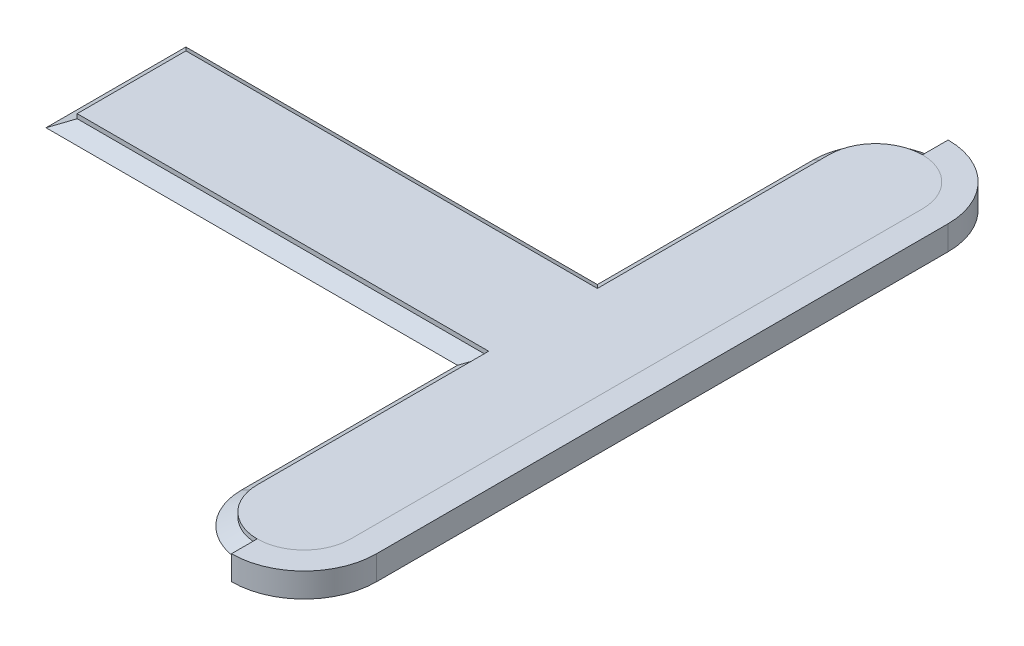
ISO-10303-21;
HEADER;
FILE_DESCRIPTION(('STEP AP214'),'2;1');
FILE_NAME('part.step','',(''),(''),'','','');
FILE_SCHEMA(('AUTOMOTIVE_DESIGN { 1 0 10303 214 1 1 1 1 }'));
ENDSEC;
DATA;
#1=APPLICATION_CONTEXT('core data for automotive mechanical design processes');
#2=APPLICATION_PROTOCOL_DEFINITION('international standard','automotive_design',2000,#1);
#3=PRODUCT_CONTEXT('',#1,'mechanical');
#4=PRODUCT('Part','Part','',(#3));
#5=PRODUCT_RELATED_PRODUCT_CATEGORY('part','',(#4));
#6=PRODUCT_DEFINITION_FORMATION('','',#4);
#7=PRODUCT_DEFINITION_CONTEXT('part definition',#1,'design');
#8=PRODUCT_DEFINITION('design','',#6,#7);
#9=PRODUCT_DEFINITION_SHAPE('','',#8);
#10=(LENGTH_UNIT() NAMED_UNIT(*) SI_UNIT(.MILLI.,.METRE.));
#11=(NAMED_UNIT(*) PLANE_ANGLE_UNIT() SI_UNIT($,.RADIAN.));
#12=(NAMED_UNIT(*) SI_UNIT($,.STERADIAN.) SOLID_ANGLE_UNIT());
#13=UNCERTAINTY_MEASURE_WITH_UNIT(LENGTH_MEASURE(1.E-05),#10,'distance_accuracy_value','');
#14=(GEOMETRIC_REPRESENTATION_CONTEXT(3) GLOBAL_UNCERTAINTY_ASSIGNED_CONTEXT((#13)) GLOBAL_UNIT_ASSIGNED_CONTEXT((#10,
#11,#12)) REPRESENTATION_CONTEXT('',''));
#15=CARTESIAN_POINT('',(0.,0.,0.));
#16=DIRECTION('',(0.,0.,1.));
#17=DIRECTION('',(1.,0.,0.));
#18=AXIS2_PLACEMENT_3D('',#15,#16,#17);
#19=CARTESIAN_POINT('',(113.157,-177.860840145929,70.5715536280061));
#20=DIRECTION('',(0.,1.,0.));
#21=DIRECTION('',(0.,0.,1.));
#22=AXIS2_PLACEMENT_3D('',#19,#20,#21);
#23=CYLINDRICAL_SURFACE('',#22,17.9070000000001);
#24=CARTESIAN_POINT('',(113.157,0.,70.5715536280061));
#25=DIRECTION('',(0.,1.,0.));
#26=DIRECTION('',(0.,0.,1.));
#27=AXIS2_PLACEMENT_3D('',#24,#25,#26);
#28=CIRCLE('',#27,17.9070000000001);
#29=CARTESIAN_POINT('',(131.064,0.,70.5715536280061));
#30=VERTEX_POINT('',#29);
#31=CARTESIAN_POINT('',(113.157,0.,88.4785536280062));
#32=VERTEX_POINT('',#31);
#33=EDGE_CURVE('E64',#30,#32,#28,.F.);
#34=ORIENTED_EDGE('',*,*,#33,.F.);
#35=DIRECTION('',(0.,1.,0.));
#36=VECTOR('',#35,1.);
#37=CARTESIAN_POINT('',(131.064,-177.860840145929,70.5715536280061));
#38=LINE('',#37,#36);
#39=CARTESIAN_POINT('',(131.064,6.,70.5715536280061));
#40=VERTEX_POINT('',#39);
#41=EDGE_CURVE('E137',#30,#40,#38,.T.);
#42=ORIENTED_EDGE('',*,*,#41,.T.);
#43=CARTESIAN_POINT('',(113.157,6.,70.5715536280061));
#44=DIRECTION('',(0.,1.,0.));
#45=DIRECTION('',(0.,0.,1.));
#46=AXIS2_PLACEMENT_3D('',#43,#44,#45);
#47=CIRCLE('',#46,17.9070000000001);
#48=CARTESIAN_POINT('',(113.157,6.,88.4785536280062));
#49=VERTEX_POINT('',#48);
#50=EDGE_CURVE('E164',#49,#40,#47,.T.);
#51=ORIENTED_EDGE('',*,*,#50,.F.);
#52=DIRECTION('',(0.,1.,0.));
#53=VECTOR('',#52,1.);
#54=CARTESIAN_POINT('',(113.157,-177.860840145929,88.4785536280062));
#55=LINE('',#54,#53);
#56=EDGE_CURVE('E124',#32,#49,#55,.T.);
#57=ORIENTED_EDGE('',*,*,#56,.F.);
#58=EDGE_LOOP('',(#34,#42,#51,#57));
#59=FACE_BOUND('',#58,.T.);
#60=ADVANCED_FACE('F57',(#59),#23,.T.);
#61=CARTESIAN_POINT('',(113.157,-177.860840145929,82.1285536280061));
#62=DIRECTION('',(-1.,0.,0.));
#63=DIRECTION('',(0.,0.,1.));
#64=AXIS2_PLACEMENT_3D('',#61,#62,#63);
#65=PLANE('',#64);
#66=DIRECTION('',(0.,0.,-1.));
#67=VECTOR('',#66,1.);
#68=CARTESIAN_POINT('',(113.157,0.,82.1285536280061));
#69=LINE('',#68,#67);
#70=CARTESIAN_POINT('',(113.157,0.,82.1285536280061));
#71=VERTEX_POINT('',#70);
#72=EDGE_CURVE('E101',#32,#71,#69,.T.);
#73=ORIENTED_EDGE('',*,*,#72,.F.);
#74=ORIENTED_EDGE('',*,*,#56,.T.);
#75=DIRECTION('',(0.,0.,1.));
#76=VECTOR('',#75,1.);
#77=CARTESIAN_POINT('',(113.157,6.,82.1285536280061));
#78=LINE('',#77,#76);
#79=CARTESIAN_POINT('',(113.157,6.,82.1285536280061));
#80=VERTEX_POINT('',#79);
#81=EDGE_CURVE('E139',#80,#49,#78,.T.);
#82=ORIENTED_EDGE('',*,*,#81,.F.);
#83=DIRECTION('',(0.,1.,0.));
#84=VECTOR('',#83,1.);
#85=CARTESIAN_POINT('',(113.157,-177.860840145929,82.1285536280061));
#86=LINE('',#85,#84);
#87=EDGE_CURVE('E122',#71,#80,#86,.T.);
#88=ORIENTED_EDGE('',*,*,#87,.F.);
#89=EDGE_LOOP('',(#73,#74,#82,#88));
#90=FACE_BOUND('',#89,.T.);
#91=ADVANCED_FACE('F189',(#90),#65,.T.);
#92=CARTESIAN_POINT('',(113.157,-177.860840145929,70.5715536280061));
#93=DIRECTION('',(0.,1.,0.));
#94=DIRECTION('',(0.,0.,1.));
#95=AXIS2_PLACEMENT_3D('',#92,#93,#94);
#96=CYLINDRICAL_SURFACE('',#95,11.557);
#97=CARTESIAN_POINT('',(113.157,0.,70.5715536280061));
#98=DIRECTION('',(0.,1.,0.));
#99=DIRECTION('',(0.,0.,1.));
#100=AXIS2_PLACEMENT_3D('',#97,#98,#99);
#101=CIRCLE('',#100,11.557);
#102=CARTESIAN_POINT('',(124.714,0.,70.5715536280061));
#103=VERTEX_POINT('',#102);
#104=EDGE_CURVE('E97',#71,#103,#101,.T.);
#105=ORIENTED_EDGE('',*,*,#104,.F.);
#106=ORIENTED_EDGE('',*,*,#87,.T.);
#107=CARTESIAN_POINT('',(113.157,6.,70.5715536280061));
#108=DIRECTION('',(0.,-1.,0.));
#109=DIRECTION('',(0.,0.,1.));
#110=AXIS2_PLACEMENT_3D('',#107,#108,#109);
#111=CIRCLE('',#110,11.557);
#112=CARTESIAN_POINT('',(124.714,6.,70.5715536280061));
#113=VERTEX_POINT('',#112);
#114=EDGE_CURVE('E120',#113,#80,#111,.T.);
#115=ORIENTED_EDGE('',*,*,#114,.F.);
#116=DIRECTION('',(0.,1.,0.));
#117=VECTOR('',#116,1.);
#118=CARTESIAN_POINT('',(124.714,-177.860840145929,70.5715536280061));
#119=LINE('',#118,#117);
#120=EDGE_CURVE('E113',#103,#113,#119,.T.);
#121=ORIENTED_EDGE('',*,*,#120,.F.);
#122=EDGE_LOOP('',(#105,#106,#115,#121));
#123=FACE_BOUND('',#122,.T.);
#124=ADVANCED_FACE('F118',(#123),#96,.F.);
#125=CARTESIAN_POINT('',(124.714,-177.860840145929,-70.571553628006));
#126=DIRECTION('',(-1.,0.,0.));
#127=DIRECTION('',(0.,0.,1.));
#128=AXIS2_PLACEMENT_3D('',#125,#126,#127);
#129=PLANE('',#128);
#130=DIRECTION('',(0.,0.,-1.));
#131=VECTOR('',#130,1.);
#132=CARTESIAN_POINT('',(124.714,0.,-70.571553628006));
#133=LINE('',#132,#131);
#134=CARTESIAN_POINT('',(124.714,0.,-70.571553628006));
#135=VERTEX_POINT('',#134);
#136=EDGE_CURVE('E100',#103,#135,#133,.T.);
#137=ORIENTED_EDGE('',*,*,#136,.F.);
#138=ORIENTED_EDGE('',*,*,#120,.T.);
#139=DIRECTION('',(0.,0.,1.));
#140=VECTOR('',#139,1.);
#141=CARTESIAN_POINT('',(124.714,6.,-70.571553628006));
#142=LINE('',#141,#140);
#143=CARTESIAN_POINT('',(124.714,6.,-70.571553628006));
#144=VERTEX_POINT('',#143);
#145=EDGE_CURVE('E150',#144,#113,#142,.T.);
#146=ORIENTED_EDGE('',*,*,#145,.F.);
#147=DIRECTION('',(0.,1.,0.));
#148=VECTOR('',#147,1.);
#149=CARTESIAN_POINT('',(124.714,-177.860840145929,-70.571553628006));
#150=LINE('',#149,#148);
#151=EDGE_CURVE('E116',#135,#144,#150,.T.);
#152=ORIENTED_EDGE('',*,*,#151,.F.);
#153=EDGE_LOOP('',(#137,#138,#146,#152));
#154=FACE_BOUND('',#153,.T.);
#155=ADVANCED_FACE('F110',(#154),#129,.T.);
#156=CARTESIAN_POINT('',(113.157,-177.860840145929,-70.571553628006));
#157=DIRECTION('',(0.,1.,0.));
#158=DIRECTION('',(0.,0.,1.));
#159=AXIS2_PLACEMENT_3D('',#156,#157,#158);
#160=CYLINDRICAL_SURFACE('',#159,11.557);
#161=CARTESIAN_POINT('',(113.157,0.,-70.571553628006));
#162=DIRECTION('',(0.,1.,0.));
#163=DIRECTION('',(0.,0.,1.));
#164=AXIS2_PLACEMENT_3D('',#161,#162,#163);
#165=CIRCLE('',#164,11.557);
#166=CARTESIAN_POINT('',(113.157,0.,-82.1285536280061));
#167=VERTEX_POINT('',#166);
#168=EDGE_CURVE('E77',#135,#167,#165,.T.);
#169=ORIENTED_EDGE('',*,*,#168,.F.);
#170=ORIENTED_EDGE('',*,*,#151,.T.);
#171=CARTESIAN_POINT('',(113.157,6.,-70.571553628006));
#172=DIRECTION('',(0.,-1.,0.));
#173=DIRECTION('',(0.,0.,1.));
#174=AXIS2_PLACEMENT_3D('',#171,#172,#173);
#175=CIRCLE('',#174,11.557);
#176=CARTESIAN_POINT('',(113.157,6.,-82.1285536280061));
#177=VERTEX_POINT('',#176);
#178=EDGE_CURVE('E175',#177,#144,#175,.T.);
#179=ORIENTED_EDGE('',*,*,#178,.F.);
#180=DIRECTION('',(0.,1.,0.));
#181=VECTOR('',#180,1.);
#182=CARTESIAN_POINT('',(113.157,-177.860840145929,-82.1285536280061));
#183=LINE('',#182,#181);
#184=EDGE_CURVE('E126',#167,#177,#183,.T.);
#185=ORIENTED_EDGE('',*,*,#184,.F.);
#186=EDGE_LOOP('',(#169,#170,#179,#185));
#187=FACE_BOUND('',#186,.T.);
#188=ADVANCED_FACE('F201',(#187),#160,.F.);
#189=CARTESIAN_POINT('',(113.157,-177.860840145929,-88.4785536280061));
#190=DIRECTION('',(-1.,0.,0.));
#191=DIRECTION('',(0.,0.,1.));
#192=AXIS2_PLACEMENT_3D('',#189,#190,#191);
#193=PLANE('',#192);
#194=DIRECTION('',(0.,0.,-1.));
#195=VECTOR('',#194,1.);
#196=CARTESIAN_POINT('',(113.157,0.,-88.4785536280061));
#197=LINE('',#196,#195);
#198=CARTESIAN_POINT('',(113.157,0.,-88.4785536280061));
#199=VERTEX_POINT('',#198);
#200=EDGE_CURVE('E71',#167,#199,#197,.T.);
#201=ORIENTED_EDGE('',*,*,#200,.F.);
#202=ORIENTED_EDGE('',*,*,#184,.T.);
#203=DIRECTION('',(0.,0.,1.));
#204=VECTOR('',#203,1.);
#205=CARTESIAN_POINT('',(113.157,6.,-88.4785536280061));
#206=LINE('',#205,#204);
#207=CARTESIAN_POINT('',(113.157,6.,-88.4785536280061));
#208=VERTEX_POINT('',#207);
#209=EDGE_CURVE('E172',#208,#177,#206,.T.);
#210=ORIENTED_EDGE('',*,*,#209,.F.);
#211=DIRECTION('',(0.,1.,0.));
#212=VECTOR('',#211,1.);
#213=CARTESIAN_POINT('',(113.157,-177.860840145929,-88.4785536280061));
#214=LINE('',#213,#212);
#215=EDGE_CURVE('E132',#199,#208,#214,.T.);
#216=ORIENTED_EDGE('',*,*,#215,.F.);
#217=EDGE_LOOP('',(#201,#202,#210,#216));
#218=FACE_BOUND('',#217,.T.);
#219=ADVANCED_FACE('F199',(#218),#193,.T.);
#220=CARTESIAN_POINT('',(113.157,-177.860840145929,-70.571553628006));
#221=DIRECTION('',(0.,1.,0.));
#222=DIRECTION('',(0.,0.,1.));
#223=AXIS2_PLACEMENT_3D('',#220,#221,#222);
#224=CYLINDRICAL_SURFACE('',#223,17.9070000000001);
#225=CARTESIAN_POINT('',(113.157,0.,-70.571553628006));
#226=DIRECTION('',(0.,1.,0.));
#227=DIRECTION('',(0.,0.,1.));
#228=AXIS2_PLACEMENT_3D('',#225,#226,#227);
#229=CIRCLE('',#228,17.9070000000001);
#230=CARTESIAN_POINT('',(131.064,0.,-70.571553628006));
#231=VERTEX_POINT('',#230);
#232=EDGE_CURVE('E154',#199,#231,#229,.F.);
#233=ORIENTED_EDGE('',*,*,#232,.F.);
#234=ORIENTED_EDGE('',*,*,#215,.T.);
#235=CARTESIAN_POINT('',(113.157,6.,-70.571553628006));
#236=DIRECTION('',(0.,1.,0.));
#237=DIRECTION('',(0.,0.,1.));
#238=AXIS2_PLACEMENT_3D('',#235,#236,#237);
#239=CIRCLE('',#238,17.9070000000001);
#240=CARTESIAN_POINT('',(131.064,6.,-70.571553628006));
#241=VERTEX_POINT('',#240);
#242=EDGE_CURVE('E169',#241,#208,#239,.T.);
#243=ORIENTED_EDGE('',*,*,#242,.F.);
#244=DIRECTION('',(0.,1.,0.));
#245=VECTOR('',#244,1.);
#246=CARTESIAN_POINT('',(131.064,-177.860840145929,-70.571553628006));
#247=LINE('',#246,#245);
#248=EDGE_CURVE('E135',#231,#241,#247,.T.);
#249=ORIENTED_EDGE('',*,*,#248,.F.);
#250=EDGE_LOOP('',(#233,#234,#243,#249));
#251=FACE_BOUND('',#250,.T.);
#252=ADVANCED_FACE('F197',(#251),#224,.T.);
#253=CARTESIAN_POINT('',(131.064,-177.860840145929,70.5715536280061));
#254=DIRECTION('',(1.,0.,0.));
#255=DIRECTION('',(0.,0.,-1.));
#256=AXIS2_PLACEMENT_3D('',#253,#254,#255);
#257=PLANE('',#256);
#258=DIRECTION('',(0.,0.,1.));
#259=VECTOR('',#258,1.);
#260=CARTESIAN_POINT('',(131.064,0.,70.5715536280061));
#261=LINE('',#260,#259);
#262=EDGE_CURVE('E12',#231,#30,#261,.T.);
#263=ORIENTED_EDGE('',*,*,#262,.F.);
#264=ORIENTED_EDGE('',*,*,#248,.T.);
#265=DIRECTION('',(0.,0.,-1.));
#266=VECTOR('',#265,1.);
#267=CARTESIAN_POINT('',(131.064,6.,70.5715536280061));
#268=LINE('',#267,#266);
#269=EDGE_CURVE('E166',#40,#241,#268,.T.);
#270=ORIENTED_EDGE('',*,*,#269,.F.);
#271=ORIENTED_EDGE('',*,*,#41,.F.);
#272=EDGE_LOOP('',(#263,#264,#270,#271));
#273=FACE_BOUND('',#272,.T.);
#274=ADVANCED_FACE('F222',(#273),#257,.T.);
#275=CARTESIAN_POINT('',(113.157,6.,70.5715536280061));
#276=DIRECTION('',(0.,1.,0.));
#277=DIRECTION('',(0.,0.,1.));
#278=AXIS2_PLACEMENT_3D('',#275,#276,#277);
#279=PLANE('',#278);
#280=ORIENTED_EDGE('',*,*,#50,.T.);
#281=ORIENTED_EDGE('',*,*,#269,.T.);
#282=ORIENTED_EDGE('',*,*,#242,.T.);
#283=ORIENTED_EDGE('',*,*,#209,.T.);
#284=ORIENTED_EDGE('',*,*,#178,.T.);
#285=ORIENTED_EDGE('',*,*,#145,.T.);
#286=ORIENTED_EDGE('',*,*,#114,.T.);
#287=ORIENTED_EDGE('',*,*,#81,.T.);
#288=EDGE_LOOP('',(#280,#281,#282,#283,#284,#285,#286,#287));
#289=FACE_BOUND('',#288,.T.);
#290=ADVANCED_FACE('F177',(#289),#279,.T.);
#291=CARTESIAN_POINT('',(113.157,0.,70.5715536280061));
#292=DIRECTION('',(0.,1.,0.));
#293=DIRECTION('',(0.,0.,1.));
#294=AXIS2_PLACEMENT_3D('',#291,#292,#293);
#295=PLANE('',#294);
#296=ORIENTED_EDGE('',*,*,#33,.T.);
#297=ORIENTED_EDGE('',*,*,#72,.T.);
#298=ORIENTED_EDGE('',*,*,#104,.T.);
#299=ORIENTED_EDGE('',*,*,#136,.T.);
#300=ORIENTED_EDGE('',*,*,#168,.T.);
#301=ORIENTED_EDGE('',*,*,#200,.T.);
#302=ORIENTED_EDGE('',*,*,#232,.T.);
#303=ORIENTED_EDGE('',*,*,#262,.T.);
#304=EDGE_LOOP('',(#296,#297,#298,#299,#300,#301,#302,#303));
#305=FACE_BOUND('',#304,.T.);
#306=ADVANCED_FACE('F99',(#305),#295,.F.);
#307=CLOSED_SHELL('',(#60,#91,#124,#155,#188,#219,#252,#274,#290,#306));
#308=MANIFOLD_SOLID_BREP('B2',#307);
#309=CARTESIAN_POINT('',(0.,6.,-13.4215536280061));
#310=DIRECTION('',(1.,0.,0.));
#311=DIRECTION('',(0.,0.,-1.));
#312=AXIS2_PLACEMENT_3D('',#309,#310,#311);
#313=PLANE('',#312);
#314=DIRECTION('',(0.,0.,-1.));
#315=VECTOR('',#314,1.);
#316=CARTESIAN_POINT('',(0.,4.91034304153466,17.7565536280061));
#317=LINE('',#316,#315);
#318=CARTESIAN_POINT('',(0.,4.91034304153466,13.4215536280061));
#319=VERTEX_POINT('',#318);
#320=CARTESIAN_POINT('',(0.,4.91034304153466,-13.4215536280061));
#321=VERTEX_POINT('',#320);
#322=EDGE_CURVE('E497',#319,#321,#317,.T.);
#323=ORIENTED_EDGE('',*,*,#322,.F.);
#324=DIRECTION('',(0.,-1.,0.));
#325=VECTOR('',#324,1.);
#326=CARTESIAN_POINT('',(0.,6.,13.4215536280061));
#327=LINE('',#326,#325);
#328=CARTESIAN_POINT('',(0.,6.,13.4215536280061));
#329=VERTEX_POINT('',#328);
#330=EDGE_CURVE('E658',#329,#319,#327,.T.);
#331=ORIENTED_EDGE('',*,*,#330,.F.);
#332=DIRECTION('',(0.,0.,1.));
#333=VECTOR('',#332,1.);
#334=CARTESIAN_POINT('',(0.,6.,-13.4215536280061));
#335=LINE('',#334,#333);
#336=CARTESIAN_POINT('',(0.,6.,-13.4215536280061));
#337=VERTEX_POINT('',#336);
#338=EDGE_CURVE('E566',#337,#329,#335,.T.);
#339=ORIENTED_EDGE('',*,*,#338,.F.);
#340=DIRECTION('',(0.,-1.,0.));
#341=VECTOR('',#340,1.);
#342=CARTESIAN_POINT('',(0.,6.,-13.4215536280061));
#343=LINE('',#342,#341);
#344=EDGE_CURVE('E625',#337,#321,#343,.T.);
#345=ORIENTED_EDGE('',*,*,#344,.T.);
#346=EDGE_LOOP('',(#323,#331,#339,#345));
#347=FACE_BOUND('',#346,.T.);
#348=ADVANCED_FACE('F284',(#347),#313,.F.);
#349=CARTESIAN_POINT('',(101.6,6.,-70.5715536280061));
#350=DIRECTION('',(1.,0.,0.));
#351=DIRECTION('',(0.,0.,-1.));
#352=AXIS2_PLACEMENT_3D('',#349,#350,#351);
#353=PLANE('',#352);
#354=DIRECTION('',(0.,0.,-1.));
#355=VECTOR('',#354,1.);
#356=CARTESIAN_POINT('',(101.6,4.91034304153466,-13.4215536280061));
#357=LINE('',#356,#355);
#358=CARTESIAN_POINT('',(101.6,4.91034304153466,-13.4215536280061));
#359=VERTEX_POINT('',#358);
#360=CARTESIAN_POINT('',(101.6,4.91034304153466,-70.5715536280061));
#361=VERTEX_POINT('',#360);
#362=EDGE_CURVE('E540',#359,#361,#357,.T.);
#363=ORIENTED_EDGE('',*,*,#362,.F.);
#364=DIRECTION('',(0.,-1.,0.));
#365=VECTOR('',#364,1.);
#366=CARTESIAN_POINT('',(101.6,6.,-13.4215536280061));
#367=LINE('',#366,#365);
#368=CARTESIAN_POINT('',(101.6,6.,-13.4215536280061));
#369=VERTEX_POINT('',#368);
#370=EDGE_CURVE('E630',#369,#359,#367,.T.);
#371=ORIENTED_EDGE('',*,*,#370,.F.);
#372=DIRECTION('',(0.,0.,1.));
#373=VECTOR('',#372,1.);
#374=CARTESIAN_POINT('',(101.6,6.,-70.5715536280061));
#375=LINE('',#374,#373);
#376=CARTESIAN_POINT('',(101.6,6.,-70.5715536280061));
#377=VERTEX_POINT('',#376);
#378=EDGE_CURVE('E586',#377,#369,#375,.T.);
#379=ORIENTED_EDGE('',*,*,#378,.F.);
#380=DIRECTION('',(0.,-1.,0.));
#381=VECTOR('',#380,1.);
#382=CARTESIAN_POINT('',(101.6,6.,-70.5715536280061));
#383=LINE('',#382,#381);
#384=EDGE_CURVE('E634',#377,#361,#383,.T.);
#385=ORIENTED_EDGE('',*,*,#384,.T.);
#386=EDGE_LOOP('',(#363,#371,#379,#385));
#387=FACE_BOUND('',#386,.T.);
#388=ADVANCED_FACE('F763',(#387),#353,.F.);
#389=CARTESIAN_POINT('',(113.157,6.,-70.5715536280061));
#390=DIRECTION('',(0.,-1.,0.));
#391=DIRECTION('',(0.,0.,-1.));
#392=AXIS2_PLACEMENT_3D('',#389,#390,#391);
#393=CYLINDRICAL_SURFACE('',#392,11.557);
#394=DIRECTION('',(0.,-1.,0.));
#395=VECTOR('',#394,1.);
#396=CARTESIAN_POINT('',(113.157,4.91034304153466,-82.1285536280061));
#397=LINE('',#396,#395);
#398=CARTESIAN_POINT('',(113.157,4.91034304153466,-82.1285536280061));
#399=VERTEX_POINT('',#398);
#400=CARTESIAN_POINT('',(113.157,3.,-82.1285536280061));
#401=VERTEX_POINT('',#400);
#402=EDGE_CURVE('E303',#399,#401,#397,.T.);
#403=ORIENTED_EDGE('',*,*,#402,.F.);
#404=CARTESIAN_POINT('',(113.157,4.91034304153466,-70.5715536280061));
#405=DIRECTION('',(0.,-1.,0.));
#406=DIRECTION('',(-1.,0.,0.));
#407=AXIS2_PLACEMENT_3D('',#404,#405,#406);
#408=CIRCLE('',#407,11.557);
#409=EDGE_CURVE('E308',#361,#399,#408,.T.);
#410=ORIENTED_EDGE('',*,*,#409,.F.);
#411=ORIENTED_EDGE('',*,*,#384,.F.);
#412=CARTESIAN_POINT('',(113.157,6.,-70.5715536280061));
#413=DIRECTION('',(0.,1.,0.));
#414=DIRECTION('',(0.,0.,1.));
#415=AXIS2_PLACEMENT_3D('',#412,#413,#414);
#416=CIRCLE('',#415,11.557);
#417=CARTESIAN_POINT('',(124.714,6.,-70.5715536280061));
#418=VERTEX_POINT('',#417);
#419=EDGE_CURVE('E583',#418,#377,#416,.T.);
#420=ORIENTED_EDGE('',*,*,#419,.F.);
#421=DIRECTION('',(0.,-1.,0.));
#422=VECTOR('',#421,1.);
#423=CARTESIAN_POINT('',(124.714,6.,-70.5715536280061));
#424=LINE('',#423,#422);
#425=CARTESIAN_POINT('',(124.714,3.,-70.5715536280061));
#426=VERTEX_POINT('',#425);
#427=EDGE_CURVE('E638',#418,#426,#424,.T.);
#428=ORIENTED_EDGE('',*,*,#427,.T.);
#429=CARTESIAN_POINT('',(113.157,3.,-70.5715536280061));
#430=DIRECTION('',(0.,-1.,0.));
#431=DIRECTION('',(0.,0.,-1.));
#432=AXIS2_PLACEMENT_3D('',#429,#430,#431);
#433=CIRCLE('',#432,11.557);
#434=EDGE_CURVE('E294',#401,#426,#433,.T.);
#435=ORIENTED_EDGE('',*,*,#434,.F.);
#436=EDGE_LOOP('',(#403,#410,#411,#420,#428,#435));
#437=FACE_BOUND('',#436,.T.);
#438=ADVANCED_FACE('F794',(#437),#393,.T.);
#439=CARTESIAN_POINT('',(101.6,6.,13.4215536280061));
#440=DIRECTION('',(1.,0.,0.));
#441=DIRECTION('',(0.,0.,-1.));
#442=AXIS2_PLACEMENT_3D('',#439,#440,#441);
#443=PLANE('',#442);
#444=DIRECTION('',(0.,0.,-1.));
#445=VECTOR('',#444,1.);
#446=CARTESIAN_POINT('',(101.6,4.91034304153466,70.5715536280061));
#447=LINE('',#446,#445);
#448=CARTESIAN_POINT('',(101.6,4.91034304153468,70.5715536280061));
#449=VERTEX_POINT('',#448);
#450=CARTESIAN_POINT('',(101.6,4.91034304153468,13.4215536280061));
#451=VERTEX_POINT('',#450);
#452=EDGE_CURVE('E448',#449,#451,#447,.T.);
#453=ORIENTED_EDGE('',*,*,#452,.F.);
#454=DIRECTION('',(0.,-1.,0.));
#455=VECTOR('',#454,1.);
#456=CARTESIAN_POINT('',(101.6,6.,70.5715536280061));
#457=LINE('',#456,#455);
#458=CARTESIAN_POINT('',(101.6,6.,70.5715536280061));
#459=VERTEX_POINT('',#458);
#460=EDGE_CURVE('E648',#459,#449,#457,.T.);
#461=ORIENTED_EDGE('',*,*,#460,.F.);
#462=DIRECTION('',(0.,0.,1.));
#463=VECTOR('',#462,1.);
#464=CARTESIAN_POINT('',(101.6,6.,13.4215536280061));
#465=LINE('',#464,#463);
#466=CARTESIAN_POINT('',(101.6,6.,13.4215536280061));
#467=VERTEX_POINT('',#466);
#468=EDGE_CURVE('E574',#467,#459,#465,.T.);
#469=ORIENTED_EDGE('',*,*,#468,.F.);
#470=DIRECTION('',(0.,-1.,0.));
#471=VECTOR('',#470,1.);
#472=CARTESIAN_POINT('',(101.6,6.,13.4215536280061));
#473=LINE('',#472,#471);
#474=EDGE_CURVE('E653',#467,#451,#473,.T.);
#475=ORIENTED_EDGE('',*,*,#474,.T.);
#476=EDGE_LOOP('',(#453,#461,#469,#475));
#477=FACE_BOUND('',#476,.T.);
#478=ADVANCED_FACE('F713',(#477),#443,.F.);
#479=CARTESIAN_POINT('',(113.157,6.,70.5715536280061));
#480=DIRECTION('',(0.,-1.,0.));
#481=DIRECTION('',(0.,0.,-1.));
#482=AXIS2_PLACEMENT_3D('',#479,#480,#481);
#483=CYLINDRICAL_SURFACE('',#482,11.557);
#484=CARTESIAN_POINT('',(113.157,4.91034304153466,70.5715536280061));
#485=DIRECTION('',(0.,-1.,0.));
#486=DIRECTION('',(0.,0.,1.));
#487=AXIS2_PLACEMENT_3D('',#484,#485,#486);
#488=CIRCLE('',#487,11.5570000000001);
#489=CARTESIAN_POINT('',(113.157,4.91034304153468,82.1285536280061));
#490=VERTEX_POINT('',#489);
#491=EDGE_CURVE('E479',#490,#449,#488,.T.);
#492=ORIENTED_EDGE('',*,*,#491,.F.);
#493=DIRECTION('',(0.,-1.,0.));
#494=VECTOR('',#493,1.);
#495=CARTESIAN_POINT('',(113.157,4.91034304153466,82.1285536280061));
#496=LINE('',#495,#494);
#497=CARTESIAN_POINT('',(113.157,3.,82.1285536280061));
#498=VERTEX_POINT('',#497);
#499=EDGE_CURVE('E296',#490,#498,#496,.T.);
#500=ORIENTED_EDGE('',*,*,#499,.T.);
#501=CARTESIAN_POINT('',(113.157,3.,70.5715536280061));
#502=DIRECTION('',(0.,-1.,0.));
#503=DIRECTION('',(0.,0.,-1.));
#504=AXIS2_PLACEMENT_3D('',#501,#502,#503);
#505=CIRCLE('',#504,11.557);
#506=CARTESIAN_POINT('',(124.714,3.,70.5715536280061));
#507=VERTEX_POINT('',#506);
#508=EDGE_CURVE('E288',#507,#498,#505,.T.);
#509=ORIENTED_EDGE('',*,*,#508,.F.);
#510=DIRECTION('',(0.,-1.,0.));
#511=VECTOR('',#510,1.);
#512=CARTESIAN_POINT('',(124.714,6.,70.5715536280061));
#513=LINE('',#512,#511);
#514=CARTESIAN_POINT('',(124.714,6.,70.5715536280061));
#515=VERTEX_POINT('',#514);
#516=EDGE_CURVE('E643',#515,#507,#513,.T.);
#517=ORIENTED_EDGE('',*,*,#516,.F.);
#518=CARTESIAN_POINT('',(113.157,6.,70.5715536280061));
#519=DIRECTION('',(0.,1.,0.));
#520=DIRECTION('',(0.,0.,1.));
#521=AXIS2_PLACEMENT_3D('',#518,#519,#520);
#522=CIRCLE('',#521,11.557);
#523=EDGE_CURVE('E577',#459,#515,#522,.T.);
#524=ORIENTED_EDGE('',*,*,#523,.F.);
#525=ORIENTED_EDGE('',*,*,#460,.T.);
#526=EDGE_LOOP('',(#492,#500,#509,#517,#524,#525));
#527=FACE_BOUND('',#526,.T.);
#528=ADVANCED_FACE('F708',(#527),#483,.T.);
#529=CARTESIAN_POINT('',(0.,6.,13.4215536280061));
#530=DIRECTION('',(0.,0.,-1.));
#531=DIRECTION('',(-1.,0.,0.));
#532=AXIS2_PLACEMENT_3D('',#529,#530,#531);
#533=PLANE('',#532);
#534=DIRECTION('',(-1.,0.,0.));
#535=VECTOR('',#534,1.);
#536=CARTESIAN_POINT('',(101.6,4.91034304153466,13.4215536280061));
#537=LINE('',#536,#535);
#538=EDGE_CURVE('E461',#451,#319,#537,.T.);
#539=ORIENTED_EDGE('',*,*,#538,.F.);
#540=ORIENTED_EDGE('',*,*,#474,.F.);
#541=DIRECTION('',(1.,0.,0.));
#542=VECTOR('',#541,1.);
#543=CARTESIAN_POINT('',(0.,6.,13.4215536280061));
#544=LINE('',#543,#542);
#545=EDGE_CURVE('E570',#329,#467,#544,.T.);
#546=ORIENTED_EDGE('',*,*,#545,.F.);
#547=ORIENTED_EDGE('',*,*,#330,.T.);
#548=EDGE_LOOP('',(#539,#540,#546,#547));
#549=FACE_BOUND('',#548,.T.);
#550=ADVANCED_FACE('F716',(#549),#533,.F.);
#551=CARTESIAN_POINT('',(113.157,1.06034304153466,-82.1285536280061));
#552=VERTEX_POINT('',#551);
#553=EDGE_CURVE('E533',#401,#552,#397,.T.);
#554=ORIENTED_EDGE('',*,*,#553,.F.);
#555=ORIENTED_EDGE('',*,*,#434,.T.);
#556=CARTESIAN_POINT('',(124.714,0.,-70.5715536280061));
#557=VERTEX_POINT('',#556);
#558=EDGE_CURVE('E637',#426,#557,#424,.T.);
#559=ORIENTED_EDGE('',*,*,#558,.T.);
#560=CARTESIAN_POINT('',(113.157,0.,-70.5715536280061));
#561=DIRECTION('',(0.,1.,0.));
#562=DIRECTION('',(0.,0.,1.));
#563=AXIS2_PLACEMENT_3D('',#560,#561,#562);
#564=CIRCLE('',#563,11.557);
#565=CARTESIAN_POINT('',(101.6,0.,-70.5715536280061));
#566=VERTEX_POINT('',#565);
#567=EDGE_CURVE('E614',#557,#566,#564,.T.);
#568=ORIENTED_EDGE('',*,*,#567,.T.);
#569=CARTESIAN_POINT('',(101.6,1.06034304153466,-70.5715536280061));
#570=VERTEX_POINT('',#569);
#571=EDGE_CURVE('E633',#570,#566,#383,.T.);
#572=ORIENTED_EDGE('',*,*,#571,.F.);
#573=CARTESIAN_POINT('',(113.157,1.06034304153466,-70.5715536280061));
#574=DIRECTION('',(0.,-1.,0.));
#575=DIRECTION('',(-1.,0.,0.));
#576=AXIS2_PLACEMENT_3D('',#573,#574,#575);
#577=CIRCLE('',#576,11.557);
#578=EDGE_CURVE('E545',#570,#552,#577,.T.);
#579=ORIENTED_EDGE('',*,*,#578,.T.);
#580=EDGE_LOOP('',(#554,#555,#559,#568,#572,#579));
#581=FACE_BOUND('',#580,.T.);
#582=ADVANCED_FACE('F773',(#581),#393,.T.);
#583=CARTESIAN_POINT('',(101.6,6.,-13.4215536280061));
#584=DIRECTION('',(0.,0.,1.));
#585=DIRECTION('',(1.,0.,0.));
#586=AXIS2_PLACEMENT_3D('',#583,#584,#585);
#587=PLANE('',#586);
#588=DIRECTION('',(1.,0.,0.));
#589=VECTOR('',#588,1.);
#590=CARTESIAN_POINT('',(-4.33500000000001,4.91034304153466,-13.4215536280061));
#591=LINE('',#590,#589);
#592=EDGE_CURVE('E502',#321,#359,#591,.T.);
#593=ORIENTED_EDGE('',*,*,#592,.F.);
#594=ORIENTED_EDGE('',*,*,#344,.F.);
#595=DIRECTION('',(-1.,0.,0.));
#596=VECTOR('',#595,1.);
#597=CARTESIAN_POINT('',(101.6,6.,-13.4215536280061));
#598=LINE('',#597,#596);
#599=EDGE_CURVE('E589',#369,#337,#598,.T.);
#600=ORIENTED_EDGE('',*,*,#599,.F.);
#601=ORIENTED_EDGE('',*,*,#370,.T.);
#602=EDGE_LOOP('',(#593,#594,#600,#601));
#603=FACE_BOUND('',#602,.T.);
#604=ADVANCED_FACE('F754',(#603),#587,.F.);
#605=CARTESIAN_POINT('',(0.,1.06034304153467,-13.4215536280061));
#606=VERTEX_POINT('',#605);
#607=CARTESIAN_POINT('',(0.,0.,-13.4215536280061));
#608=VERTEX_POINT('',#607);
#609=EDGE_CURVE('E592',#606,#608,#343,.T.);
#610=ORIENTED_EDGE('',*,*,#609,.F.);
#611=DIRECTION('',(1.,0.,0.));
#612=VECTOR('',#611,1.);
#613=CARTESIAN_POINT('',(-4.33500000000001,1.06034304153466,-13.4215536280061));
#614=LINE('',#613,#612);
#615=CARTESIAN_POINT('',(101.6,1.06034304153466,-13.4215536280061));
#616=VERTEX_POINT('',#615);
#617=EDGE_CURVE('E512',#606,#616,#614,.T.);
#618=ORIENTED_EDGE('',*,*,#617,.T.);
#619=CARTESIAN_POINT('',(101.6,0.,-13.4215536280061));
#620=VERTEX_POINT('',#619);
#621=EDGE_CURVE('E629',#616,#620,#367,.T.);
#622=ORIENTED_EDGE('',*,*,#621,.T.);
#623=DIRECTION('',(-1.,0.,0.));
#624=VECTOR('',#623,1.);
#625=CARTESIAN_POINT('',(101.6,0.,-13.4215536280061));
#626=LINE('',#625,#624);
#627=EDGE_CURVE('E571',#620,#608,#626,.T.);
#628=ORIENTED_EDGE('',*,*,#627,.T.);
#629=EDGE_LOOP('',(#610,#618,#622,#628));
#630=FACE_BOUND('',#629,.T.);
#631=ADVANCED_FACE('F732',(#630),#587,.F.);
#632=CARTESIAN_POINT('',(101.6,1.06034304153466,13.4215536280061));
#633=VERTEX_POINT('',#632);
#634=CARTESIAN_POINT('',(101.6,0.,13.4215536280061));
#635=VERTEX_POINT('',#634);
#636=EDGE_CURVE('E652',#633,#635,#473,.T.);
#637=ORIENTED_EDGE('',*,*,#636,.F.);
#638=DIRECTION('',(-1.,0.,0.));
#639=VECTOR('',#638,1.);
#640=CARTESIAN_POINT('',(101.6,1.06034304153466,13.4215536280061));
#641=LINE('',#640,#639);
#642=CARTESIAN_POINT('',(0.,1.06034304153466,13.4215536280061));
#643=VERTEX_POINT('',#642);
#644=EDGE_CURVE('E443',#633,#643,#641,.T.);
#645=ORIENTED_EDGE('',*,*,#644,.T.);
#646=CARTESIAN_POINT('',(0.,0.,13.4215536280061));
#647=VERTEX_POINT('',#646);
#648=EDGE_CURVE('E657',#643,#647,#327,.T.);
#649=ORIENTED_EDGE('',*,*,#648,.T.);
#650=DIRECTION('',(1.,0.,0.));
#651=VECTOR('',#650,1.);
#652=CARTESIAN_POINT('',(0.,0.,13.4215536280061));
#653=LINE('',#652,#651);
#654=EDGE_CURVE('E597',#647,#635,#653,.T.);
#655=ORIENTED_EDGE('',*,*,#654,.T.);
#656=EDGE_LOOP('',(#637,#645,#649,#655));
#657=FACE_BOUND('',#656,.T.);
#658=ADVANCED_FACE('F799',(#657),#533,.F.);
#659=ORIENTED_EDGE('',*,*,#648,.F.);
#660=DIRECTION('',(0.,0.,-1.));
#661=VECTOR('',#660,1.);
#662=CARTESIAN_POINT('',(0.,1.06034304153466,17.7565536280061));
#663=LINE('',#662,#661);
#664=EDGE_CURVE('E506',#643,#606,#663,.T.);
#665=ORIENTED_EDGE('',*,*,#664,.T.);
#666=ORIENTED_EDGE('',*,*,#609,.T.);
#667=DIRECTION('',(0.,0.,1.));
#668=VECTOR('',#667,1.);
#669=CARTESIAN_POINT('',(0.,0.,-13.4215536280061));
#670=LINE('',#669,#668);
#671=EDGE_CURVE('E593',#608,#647,#670,.T.);
#672=ORIENTED_EDGE('',*,*,#671,.T.);
#673=EDGE_LOOP('',(#659,#665,#666,#672));
#674=FACE_BOUND('',#673,.T.);
#675=ADVANCED_FACE('F286',(#674),#313,.F.);
#676=CARTESIAN_POINT('',(101.6,1.06034304153465,70.5715536280061));
#677=VERTEX_POINT('',#676);
#678=CARTESIAN_POINT('',(101.6,0.,70.5715536280061));
#679=VERTEX_POINT('',#678);
#680=EDGE_CURVE('E647',#677,#679,#457,.T.);
#681=ORIENTED_EDGE('',*,*,#680,.F.);
#682=DIRECTION('',(0.,0.,-1.));
#683=VECTOR('',#682,1.);
#684=CARTESIAN_POINT('',(101.6,1.06034304153466,70.5715536280061));
#685=LINE('',#684,#683);
#686=EDGE_CURVE('E475',#677,#633,#685,.T.);
#687=ORIENTED_EDGE('',*,*,#686,.T.);
#688=ORIENTED_EDGE('',*,*,#636,.T.);
#689=DIRECTION('',(0.,0.,1.));
#690=VECTOR('',#689,1.);
#691=CARTESIAN_POINT('',(101.6,0.,13.4215536280061));
#692=LINE('',#691,#690);
#693=EDGE_CURVE('E602',#635,#679,#692,.T.);
#694=ORIENTED_EDGE('',*,*,#693,.T.);
#695=EDGE_LOOP('',(#681,#687,#688,#694));
#696=FACE_BOUND('',#695,.T.);
#697=ADVANCED_FACE('F798',(#696),#443,.F.);
#698=ORIENTED_EDGE('',*,*,#508,.T.);
#699=CARTESIAN_POINT('',(113.157,1.06034304153465,82.1285536280061));
#700=VERTEX_POINT('',#699);
#701=EDGE_CURVE('E55',#498,#700,#496,.T.);
#702=ORIENTED_EDGE('',*,*,#701,.T.);
#703=CARTESIAN_POINT('',(113.157,1.06034304153466,70.5715536280061));
#704=DIRECTION('',(0.,-1.,0.));
#705=DIRECTION('',(0.,0.,1.));
#706=AXIS2_PLACEMENT_3D('',#703,#704,#705);
#707=CIRCLE('',#706,11.5570000000001);
#708=EDGE_CURVE('E687',#700,#677,#707,.T.);
#709=ORIENTED_EDGE('',*,*,#708,.T.);
#710=ORIENTED_EDGE('',*,*,#680,.T.);
#711=CARTESIAN_POINT('',(113.157,0.,70.5715536280061));
#712=DIRECTION('',(0.,1.,0.));
#713=DIRECTION('',(0.,0.,1.));
#714=AXIS2_PLACEMENT_3D('',#711,#712,#713);
#715=CIRCLE('',#714,11.557);
#716=CARTESIAN_POINT('',(124.714,0.,70.5715536280061));
#717=VERTEX_POINT('',#716);
#718=EDGE_CURVE('E606',#679,#717,#715,.T.);
#719=ORIENTED_EDGE('',*,*,#718,.T.);
#720=EDGE_CURVE('E642',#507,#717,#513,.T.);
#721=ORIENTED_EDGE('',*,*,#720,.F.);
#722=EDGE_LOOP('',(#698,#702,#709,#710,#719,#721));
#723=FACE_BOUND('',#722,.T.);
#724=ADVANCED_FACE('F671',(#723),#483,.T.);
#725=CARTESIAN_POINT('',(124.714,6.,70.5715536280061));
#726=DIRECTION('',(-1.,0.,0.));
#727=DIRECTION('',(0.,0.,1.));
#728=AXIS2_PLACEMENT_3D('',#725,#726,#727);
#729=PLANE('',#728);
#730=DIRECTION('',(0.,0.,-1.));
#731=VECTOR('',#730,1.);
#732=CARTESIAN_POINT('',(124.714,0.,70.5715536280061));
#733=LINE('',#732,#731);
#734=EDGE_CURVE('E610',#717,#557,#733,.T.);
#735=ORIENTED_EDGE('',*,*,#734,.T.);
#736=ORIENTED_EDGE('',*,*,#558,.F.);
#737=ORIENTED_EDGE('',*,*,#427,.F.);
#738=DIRECTION('',(0.,0.,-1.));
#739=VECTOR('',#738,1.);
#740=CARTESIAN_POINT('',(124.714,6.,70.5715536280061));
#741=LINE('',#740,#739);
#742=EDGE_CURVE('E580',#515,#418,#741,.T.);
#743=ORIENTED_EDGE('',*,*,#742,.F.);
#744=ORIENTED_EDGE('',*,*,#516,.T.);
#745=ORIENTED_EDGE('',*,*,#720,.T.);
#746=EDGE_LOOP('',(#735,#736,#737,#743,#744,#745));
#747=FACE_BOUND('',#746,.T.);
#748=ADVANCED_FACE('F824',(#747),#729,.F.);
#749=ORIENTED_EDGE('',*,*,#621,.F.);
#750=DIRECTION('',(0.,0.,-1.));
#751=VECTOR('',#750,1.);
#752=CARTESIAN_POINT('',(101.6,1.06034304153466,-13.4215536280061));
#753=LINE('',#752,#751);
#754=EDGE_CURVE('E524',#616,#570,#753,.T.);
#755=ORIENTED_EDGE('',*,*,#754,.T.);
#756=ORIENTED_EDGE('',*,*,#571,.T.);
#757=DIRECTION('',(0.,0.,1.));
#758=VECTOR('',#757,1.);
#759=CARTESIAN_POINT('',(101.6,0.,-70.5715536280061));
#760=LINE('',#759,#758);
#761=EDGE_CURVE('E618',#566,#620,#760,.T.);
#762=ORIENTED_EDGE('',*,*,#761,.T.);
#763=EDGE_LOOP('',(#749,#755,#756,#762));
#764=FACE_BOUND('',#763,.T.);
#765=ADVANCED_FACE('F796',(#764),#353,.F.);
#766=CARTESIAN_POINT('',(113.157,6.,70.5715536280061));
#767=DIRECTION('',(0.,1.,0.));
#768=DIRECTION('',(0.,0.,1.));
#769=AXIS2_PLACEMENT_3D('',#766,#767,#768);
#770=PLANE('',#769);
#771=ORIENTED_EDGE('',*,*,#338,.T.);
#772=ORIENTED_EDGE('',*,*,#545,.T.);
#773=ORIENTED_EDGE('',*,*,#468,.T.);
#774=ORIENTED_EDGE('',*,*,#523,.T.);
#775=ORIENTED_EDGE('',*,*,#742,.T.);
#776=ORIENTED_EDGE('',*,*,#419,.T.);
#777=ORIENTED_EDGE('',*,*,#378,.T.);
#778=ORIENTED_EDGE('',*,*,#599,.T.);
#779=EDGE_LOOP('',(#771,#772,#773,#774,#775,#776,#777,#778));
#780=FACE_BOUND('',#779,.T.);
#781=ADVANCED_FACE('F759',(#780),#770,.T.);
#782=CARTESIAN_POINT('',(113.157,0.,70.5715536280061));
#783=DIRECTION('',(0.,1.,0.));
#784=DIRECTION('',(0.,0.,1.));
#785=AXIS2_PLACEMENT_3D('',#782,#783,#784);
#786=PLANE('',#785);
#787=ORIENTED_EDGE('',*,*,#671,.F.);
#788=ORIENTED_EDGE('',*,*,#627,.F.);
#789=ORIENTED_EDGE('',*,*,#761,.F.);
#790=ORIENTED_EDGE('',*,*,#567,.F.);
#791=ORIENTED_EDGE('',*,*,#734,.F.);
#792=ORIENTED_EDGE('',*,*,#718,.F.);
#793=ORIENTED_EDGE('',*,*,#693,.F.);
#794=ORIENTED_EDGE('',*,*,#654,.F.);
#795=EDGE_LOOP('',(#787,#788,#789,#790,#791,#792,#793,#794));
#796=FACE_BOUND('',#795,.T.);
#797=ADVANCED_FACE('F778',(#796),#786,.F.);
#798=CARTESIAN_POINT('',(113.157,0.,0.));
#799=DIRECTION('',(-1.,0.,0.));
#800=DIRECTION('',(0.,0.,1.));
#801=AXIS2_PLACEMENT_3D('',#798,#799,#800);
#802=PLANE('',#801);
#803=DIRECTION('',(0.,0.447213595499957,0.894427190999916));
#804=VECTOR('',#803,1.);
#805=CARTESIAN_POINT('',(113.157,4.91034304153466,-82.1285536280061));
#806=LINE('',#805,#804);
#807=CARTESIAN_POINT('',(113.157,2.98534304153466,-85.9785536280061));
#808=VERTEX_POINT('',#807);
#809=EDGE_CURVE('E536',#808,#399,#806,.T.);
#810=ORIENTED_EDGE('',*,*,#809,.T.);
#811=ORIENTED_EDGE('',*,*,#402,.T.);
#812=ORIENTED_EDGE('',*,*,#553,.T.);
#813=DIRECTION('',(0.,0.447213595499957,-0.894427190999916));
#814=VECTOR('',#813,1.);
#815=CARTESIAN_POINT('',(113.157,1.06034304153466,-82.1285536280061));
#816=LINE('',#815,#814);
#817=EDGE_CURVE('E552',#552,#808,#816,.T.);
#818=ORIENTED_EDGE('',*,*,#817,.T.);
#819=EDGE_LOOP('',(#810,#811,#812,#818));
#820=FACE_BOUND('',#819,.T.);
#821=ADVANCED_FACE('F775',(#820),#802,.F.);
#822=CARTESIAN_POINT('',(113.157,0.,0.));
#823=DIRECTION('',(1.,0.,0.));
#824=DIRECTION('',(0.,0.,-1.));
#825=AXIS2_PLACEMENT_3D('',#822,#823,#824);
#826=PLANE('',#825);
#827=DIRECTION('',(0.,0.447213595499957,-0.894427190999916));
#828=VECTOR('',#827,1.);
#829=CARTESIAN_POINT('',(113.157,4.91034304153466,82.1285536280061));
#830=LINE('',#829,#828);
#831=CARTESIAN_POINT('',(113.157,2.98534304153466,85.9785536280061));
#832=VERTEX_POINT('',#831);
#833=EDGE_CURVE('E681',#832,#490,#830,.T.);
#834=ORIENTED_EDGE('',*,*,#833,.F.);
#835=DIRECTION('',(0.,0.447213595499957,0.894427190999916));
#836=VECTOR('',#835,1.);
#837=CARTESIAN_POINT('',(113.157,1.06034304153466,82.1285536280061));
#838=LINE('',#837,#836);
#839=EDGE_CURVE('E598',#700,#832,#838,.T.);
#840=ORIENTED_EDGE('',*,*,#839,.F.);
#841=ORIENTED_EDGE('',*,*,#701,.F.);
#842=ORIENTED_EDGE('',*,*,#499,.F.);
#843=EDGE_LOOP('',(#834,#840,#841,#842));
#844=FACE_BOUND('',#843,.T.);
#845=ADVANCED_FACE('F677',(#844),#826,.T.);
#846=CARTESIAN_POINT('',(101.6,1.06034304153466,-13.4215536280061));
#847=DIRECTION('',(-0.447213595499957,-0.894427190999916,0.));
#848=DIRECTION('',(0.894427190999916,-0.447213595499958,0.));
#849=AXIS2_PLACEMENT_3D('',#846,#847,#848);
#850=PLANE('',#849);
#851=DIRECTION('',(0.666666666666667,-0.333333333333333,0.666666666666667));
#852=VECTOR('',#851,1.);
#853=CARTESIAN_POINT('',(54.5177777777778,24.6014541526458,-60.5037758502283));
#854=LINE('',#853,#852);
#855=CARTESIAN_POINT('',(97.75,2.98534304153467,-17.2715536280061));
#856=VERTEX_POINT('',#855);
#857=EDGE_CURVE('E516',#856,#616,#854,.T.);
#858=ORIENTED_EDGE('',*,*,#857,.F.);
#859=DIRECTION('',(0.,0.,-1.));
#860=VECTOR('',#859,1.);
#861=CARTESIAN_POINT('',(97.75,2.98534304153466,-13.4215536280061));
#862=LINE('',#861,#860);
#863=CARTESIAN_POINT('',(97.75,2.98534304153466,-70.5715536280061));
#864=VERTEX_POINT('',#863);
#865=EDGE_CURVE('E549',#856,#864,#862,.T.);
#866=ORIENTED_EDGE('',*,*,#865,.T.);
#867=DIRECTION('',(-0.894427190999916,0.447213595499957,0.));
#868=VECTOR('',#867,1.);
#869=CARTESIAN_POINT('',(101.6,1.06034304153466,-70.5715536280061));
#870=LINE('',#869,#868);
#871=EDGE_CURVE('E560',#570,#864,#870,.T.);
#872=ORIENTED_EDGE('',*,*,#871,.F.);
#873=ORIENTED_EDGE('',*,*,#754,.F.);
#874=EDGE_LOOP('',(#858,#866,#872,#873));
#875=FACE_BOUND('',#874,.T.);
#876=ADVANCED_FACE('F743',(#875),#850,.T.);
#877=CARTESIAN_POINT('',(101.6,4.91034304153466,-13.4215536280061));
#878=DIRECTION('',(-0.447213595499957,0.894427190999916,0.));
#879=DIRECTION('',(-0.894427190999916,-0.447213595499957,0.));
#880=AXIS2_PLACEMENT_3D('',#877,#878,#879);
#881=PLANE('',#880);
#882=DIRECTION('',(-0.666666666666667,-0.333333333333333,-0.666666666666667));
#883=VECTOR('',#882,1.);
#884=CARTESIAN_POINT('',(54.5177777777778,-18.6307680695764,-60.5037758502283));
#885=LINE('',#884,#883);
#886=EDGE_CURVE('E520',#359,#856,#885,.T.);
#887=ORIENTED_EDGE('',*,*,#886,.F.);
#888=ORIENTED_EDGE('',*,*,#362,.T.);
#889=DIRECTION('',(0.894427190999916,0.447213595499957,0.));
#890=VECTOR('',#889,1.);
#891=CARTESIAN_POINT('',(101.6,4.91034304153466,-70.5715536280061));
#892=LINE('',#891,#890);
#893=EDGE_CURVE('E544',#864,#361,#892,.T.);
#894=ORIENTED_EDGE('',*,*,#893,.F.);
#895=ORIENTED_EDGE('',*,*,#865,.F.);
#896=EDGE_LOOP('',(#887,#888,#894,#895));
#897=FACE_BOUND('',#896,.T.);
#898=ADVANCED_FACE('F749',(#897),#881,.T.);
#899=CARTESIAN_POINT('',(113.157,1.06034304153466,-70.5715536280061));
#900=DIRECTION('',(0.,1.,0.));
#901=DIRECTION('',(0.,0.,1.));
#902=AXIS2_PLACEMENT_3D('',#899,#900,#901);
#903=CONICAL_SURFACE('',#902,11.557,1.10714871779409);
#904=CARTESIAN_POINT('',(113.157,2.98534304153466,-70.5715536280061));
#905=DIRECTION('',(0.,-1.,0.));
#906=DIRECTION('',(-1.,0.,0.));
#907=AXIS2_PLACEMENT_3D('',#904,#905,#906);
#908=CIRCLE('',#907,15.407);
#909=EDGE_CURVE('E539',#864,#808,#908,.T.);
#910=ORIENTED_EDGE('',*,*,#909,.T.);
#911=ORIENTED_EDGE('',*,*,#817,.F.);
#912=ORIENTED_EDGE('',*,*,#578,.F.);
#913=ORIENTED_EDGE('',*,*,#871,.T.);
#914=EDGE_LOOP('',(#910,#911,#912,#913));
#915=FACE_BOUND('',#914,.T.);
#916=ADVANCED_FACE('F769',(#915),#903,.T.);
#917=CARTESIAN_POINT('',(113.157,2.98534304153466,-70.5715536280061));
#918=DIRECTION('',(0.,-1.,0.));
#919=DIRECTION('',(0.,0.,-1.));
#920=AXIS2_PLACEMENT_3D('',#917,#918,#919);
#921=CONICAL_SURFACE('',#920,15.407,1.10714871779409);
#922=ORIENTED_EDGE('',*,*,#409,.T.);
#923=ORIENTED_EDGE('',*,*,#809,.F.);
#924=ORIENTED_EDGE('',*,*,#909,.F.);
#925=ORIENTED_EDGE('',*,*,#893,.T.);
#926=EDGE_LOOP('',(#922,#923,#924,#925));
#927=FACE_BOUND('',#926,.T.);
#928=ADVANCED_FACE('F765',(#927),#921,.T.);
#929=CARTESIAN_POINT('',(-4.33500000000001,1.06034304153466,-13.4215536280061));
#930=DIRECTION('',(0.,-0.894427190999916,-0.447213595499957));
#931=DIRECTION('',(0.,0.447213595499957,-0.894427190999916));
#932=AXIS2_PLACEMENT_3D('',#929,#930,#931);
#933=PLANE('',#932);
#934=DIRECTION('',(1.,0.,0.));
#935=VECTOR('',#934,1.);
#936=CARTESIAN_POINT('',(-4.33500000000001,2.98534304153466,-17.2715536280061));
#937=LINE('',#936,#935);
#938=CARTESIAN_POINT('',(-3.85000000000001,2.98534304153466,-17.2715536280061));
#939=VERTEX_POINT('',#938);
#940=EDGE_CURVE('E515',#939,#856,#937,.T.);
#941=ORIENTED_EDGE('',*,*,#940,.T.);
#942=ORIENTED_EDGE('',*,*,#857,.T.);
#943=ORIENTED_EDGE('',*,*,#617,.F.);
#944=DIRECTION('',(0.666666666666667,-0.333333333333333,0.666666666666667));
#945=VECTOR('',#944,1.);
#946=CARTESIAN_POINT('',(13.8569365582276,-5.86812523757913,0.435382930221551));
#947=LINE('',#946,#945);
#948=EDGE_CURVE('E496',#939,#606,#947,.T.);
#949=ORIENTED_EDGE('',*,*,#948,.F.);
#950=EDGE_LOOP('',(#941,#942,#943,#949));
#951=FACE_BOUND('',#950,.T.);
#952=ADVANCED_FACE('F738',(#951),#933,.T.);
#953=CARTESIAN_POINT('',(-4.33500000000001,4.91034304153466,-13.4215536280061));
#954=DIRECTION('',(0.,0.894427190999916,-0.447213595499957));
#955=DIRECTION('',(0.,0.447213595499957,0.894427190999916));
#956=AXIS2_PLACEMENT_3D('',#953,#954,#955);
#957=PLANE('',#956);
#958=ORIENTED_EDGE('',*,*,#592,.T.);
#959=ORIENTED_EDGE('',*,*,#886,.T.);
#960=ORIENTED_EDGE('',*,*,#940,.F.);
#961=DIRECTION('',(-0.666666666666667,-0.333333333333333,-0.666666666666667));
#962=VECTOR('',#961,1.);
#963=CARTESIAN_POINT('',(13.8569365582276,11.8388113206485,0.435382930221551));
#964=LINE('',#963,#962);
#965=EDGE_CURVE('E488',#321,#939,#964,.T.);
#966=ORIENTED_EDGE('',*,*,#965,.F.);
#967=EDGE_LOOP('',(#958,#959,#960,#966));
#968=FACE_BOUND('',#967,.T.);
#969=ADVANCED_FACE('F751',(#968),#957,.T.);
#970=CARTESIAN_POINT('',(0.,4.91034304153466,17.7565536280061));
#971=DIRECTION('',(-0.447213595499957,0.894427190999916,0.));
#972=DIRECTION('',(-0.894427190999916,-0.447213595499957,0.));
#973=AXIS2_PLACEMENT_3D('',#970,#971,#972);
#974=PLANE('',#973);
#975=ORIENTED_EDGE('',*,*,#322,.T.);
#976=ORIENTED_EDGE('',*,*,#965,.T.);
#977=DIRECTION('',(0.,0.,-1.));
#978=VECTOR('',#977,1.);
#979=CARTESIAN_POINT('',(-3.85000000000001,2.98534304153466,17.7565536280061));
#980=LINE('',#979,#978);
#981=CARTESIAN_POINT('',(-3.84999999999999,2.98534304153466,17.2715536280061));
#982=VERTEX_POINT('',#981);
#983=EDGE_CURVE('E501',#982,#939,#980,.T.);
#984=ORIENTED_EDGE('',*,*,#983,.F.);
#985=DIRECTION('',(-0.666666666666667,-0.333333333333333,0.666666666666667));
#986=VECTOR('',#985,1.);
#987=CARTESIAN_POINT('',(45.1555555555556,27.4881208193124,-31.7340019275495));
#988=LINE('',#987,#986);
#989=EDGE_CURVE('E459',#319,#982,#988,.T.);
#990=ORIENTED_EDGE('',*,*,#989,.F.);
#991=EDGE_LOOP('',(#975,#976,#984,#990));
#992=FACE_BOUND('',#991,.T.);
#993=ADVANCED_FACE('F722',(#992),#974,.T.);
#994=CARTESIAN_POINT('',(0.,1.06034304153466,17.7565536280061));
#995=DIRECTION('',(-0.447213595499957,-0.894427190999916,0.));
#996=DIRECTION('',(0.894427190999916,-0.447213595499958,0.));
#997=AXIS2_PLACEMENT_3D('',#994,#995,#996);
#998=PLANE('',#997);
#999=ORIENTED_EDGE('',*,*,#983,.T.);
#1000=ORIENTED_EDGE('',*,*,#948,.T.);
#1001=ORIENTED_EDGE('',*,*,#664,.F.);
#1002=DIRECTION('',(0.666666666666667,-0.333333333333333,-0.666666666666667));
#1003=VECTOR('',#1002,1.);
#1004=CARTESIAN_POINT('',(45.1555555555556,-21.5174347362431,-31.7340019275495));
#1005=LINE('',#1004,#1003);
#1006=EDGE_CURVE('E485',#982,#643,#1005,.T.);
#1007=ORIENTED_EDGE('',*,*,#1006,.F.);
#1008=EDGE_LOOP('',(#999,#1000,#1001,#1007));
#1009=FACE_BOUND('',#1008,.T.);
#1010=ADVANCED_FACE('F725',(#1009),#998,.T.);
#1011=CARTESIAN_POINT('',(101.6,4.91034304153466,13.4215536280061));
#1012=DIRECTION('',(0.,0.894427190999916,0.447213595499957));
#1013=DIRECTION('',(0.,-0.447213595499957,0.894427190999916));
#1014=AXIS2_PLACEMENT_3D('',#1011,#1012,#1013);
#1015=PLANE('',#1014);
#1016=ORIENTED_EDGE('',*,*,#538,.T.);
#1017=ORIENTED_EDGE('',*,*,#989,.T.);
#1018=DIRECTION('',(-1.,0.,0.));
#1019=VECTOR('',#1018,1.);
#1020=CARTESIAN_POINT('',(101.6,2.98534304153466,17.2715536280061));
#1021=LINE('',#1020,#1019);
#1022=CARTESIAN_POINT('',(97.75,2.98534304153467,17.2715536280061));
#1023=VERTEX_POINT('',#1022);
#1024=EDGE_CURVE('E442',#1023,#982,#1021,.T.);
#1025=ORIENTED_EDGE('',*,*,#1024,.F.);
#1026=DIRECTION('',(-0.666666666666667,-0.333333333333333,0.666666666666667));
#1027=VECTOR('',#1026,1.);
#1028=CARTESIAN_POINT('',(76.2,-7.78965695846532,38.8215536280061));
#1029=LINE('',#1028,#1027);
#1030=EDGE_CURVE('E449',#451,#1023,#1029,.T.);
#1031=ORIENTED_EDGE('',*,*,#1030,.F.);
#1032=EDGE_LOOP('',(#1016,#1017,#1025,#1031));
#1033=FACE_BOUND('',#1032,.T.);
#1034=ADVANCED_FACE('F456',(#1033),#1015,.T.);
#1035=CARTESIAN_POINT('',(101.6,1.06034304153466,13.4215536280061));
#1036=DIRECTION('',(0.,-0.894427190999916,0.447213595499957));
#1037=DIRECTION('',(0.,-0.447213595499958,-0.894427190999916));
#1038=AXIS2_PLACEMENT_3D('',#1035,#1036,#1037);
#1039=PLANE('',#1038);
#1040=ORIENTED_EDGE('',*,*,#1024,.T.);
#1041=ORIENTED_EDGE('',*,*,#1006,.T.);
#1042=ORIENTED_EDGE('',*,*,#644,.F.);
#1043=DIRECTION('',(0.666666666666667,-0.333333333333333,-0.666666666666667));
#1044=VECTOR('',#1043,1.);
#1045=CARTESIAN_POINT('',(76.2,13.7603430415346,38.8215536280061));
#1046=LINE('',#1045,#1044);
#1047=EDGE_CURVE('E438',#1023,#633,#1046,.T.);
#1048=ORIENTED_EDGE('',*,*,#1047,.F.);
#1049=EDGE_LOOP('',(#1040,#1041,#1042,#1048));
#1050=FACE_BOUND('',#1049,.T.);
#1051=ADVANCED_FACE('F440',(#1050),#1039,.T.);
#1052=CARTESIAN_POINT('',(113.157,1.06034304153466,70.5715536280061));
#1053=DIRECTION('',(0.,1.,0.));
#1054=DIRECTION('',(0.,0.,1.));
#1055=AXIS2_PLACEMENT_3D('',#1052,#1053,#1054);
#1056=CONICAL_SURFACE('',#1055,11.5570000000001,1.10714871779409);
#1057=CARTESIAN_POINT('',(113.157,2.98534304153466,70.5715536280061));
#1058=DIRECTION('',(0.,-1.,0.));
#1059=DIRECTION('',(0.,0.,1.));
#1060=AXIS2_PLACEMENT_3D('',#1057,#1058,#1059);
#1061=CIRCLE('',#1060,15.4070000000001);
#1062=CARTESIAN_POINT('',(97.75,2.98534304153466,70.5715536280061));
#1063=VERTEX_POINT('',#1062);
#1064=EDGE_CURVE('E694',#832,#1063,#1061,.T.);
#1065=ORIENTED_EDGE('',*,*,#1064,.T.);
#1066=DIRECTION('',(-0.894427190999916,0.447213595499957,0.));
#1067=VECTOR('',#1066,1.);
#1068=CARTESIAN_POINT('',(101.6,1.06034304153466,70.5715536280061));
#1069=LINE('',#1068,#1067);
#1070=EDGE_CURVE('E473',#677,#1063,#1069,.T.);
#1071=ORIENTED_EDGE('',*,*,#1070,.F.);
#1072=ORIENTED_EDGE('',*,*,#708,.F.);
#1073=ORIENTED_EDGE('',*,*,#839,.T.);
#1074=EDGE_LOOP('',(#1065,#1071,#1072,#1073));
#1075=FACE_BOUND('',#1074,.T.);
#1076=ADVANCED_FACE('F688',(#1075),#1056,.T.);
#1077=CARTESIAN_POINT('',(113.157,2.98534304153466,70.5715536280061));
#1078=DIRECTION('',(0.,-1.,0.));
#1079=DIRECTION('',(0.,0.,-1.));
#1080=AXIS2_PLACEMENT_3D('',#1077,#1078,#1079);
#1081=CONICAL_SURFACE('',#1080,15.4070000000001,1.10714871779409);
#1082=ORIENTED_EDGE('',*,*,#491,.T.);
#1083=DIRECTION('',(0.894427190999916,0.447213595499957,0.));
#1084=VECTOR('',#1083,1.);
#1085=CARTESIAN_POINT('',(101.6,4.91034304153466,70.5715536280061));
#1086=LINE('',#1085,#1084);
#1087=EDGE_CURVE('E699',#1063,#449,#1086,.T.);
#1088=ORIENTED_EDGE('',*,*,#1087,.F.);
#1089=ORIENTED_EDGE('',*,*,#1064,.F.);
#1090=ORIENTED_EDGE('',*,*,#833,.T.);
#1091=EDGE_LOOP('',(#1082,#1088,#1089,#1090));
#1092=FACE_BOUND('',#1091,.T.);
#1093=ADVANCED_FACE('F707',(#1092),#1081,.T.);
#1094=CARTESIAN_POINT('',(101.6,1.06034304153466,70.5715536280061));
#1095=DIRECTION('',(-0.447213595499957,-0.894427190999916,0.));
#1096=DIRECTION('',(0.894427190999916,-0.447213595499958,0.));
#1097=AXIS2_PLACEMENT_3D('',#1094,#1095,#1096);
#1098=PLANE('',#1097);
#1099=DIRECTION('',(0.,0.,-1.));
#1100=VECTOR('',#1099,1.);
#1101=CARTESIAN_POINT('',(97.75,2.98534304153466,70.5715536280061));
#1102=LINE('',#1101,#1100);
#1103=EDGE_CURVE('E466',#1063,#1023,#1102,.T.);
#1104=ORIENTED_EDGE('',*,*,#1103,.T.);
#1105=ORIENTED_EDGE('',*,*,#1047,.T.);
#1106=ORIENTED_EDGE('',*,*,#686,.F.);
#1107=ORIENTED_EDGE('',*,*,#1070,.T.);
#1108=EDGE_LOOP('',(#1104,#1105,#1106,#1107));
#1109=FACE_BOUND('',#1108,.T.);
#1110=ADVANCED_FACE('F471',(#1109),#1098,.T.);
#1111=CARTESIAN_POINT('',(101.6,4.91034304153466,70.5715536280061));
#1112=DIRECTION('',(-0.447213595499957,0.894427190999916,0.));
#1113=DIRECTION('',(-0.894427190999916,-0.447213595499957,0.));
#1114=AXIS2_PLACEMENT_3D('',#1111,#1112,#1113);
#1115=PLANE('',#1114);
#1116=ORIENTED_EDGE('',*,*,#452,.T.);
#1117=ORIENTED_EDGE('',*,*,#1030,.T.);
#1118=ORIENTED_EDGE('',*,*,#1103,.F.);
#1119=ORIENTED_EDGE('',*,*,#1087,.T.);
#1120=EDGE_LOOP('',(#1116,#1117,#1118,#1119));
#1121=FACE_BOUND('',#1120,.T.);
#1122=ADVANCED_FACE('F464',(#1121),#1115,.T.);
#1123=CLOSED_SHELL('',(#348,#388,#438,#478,#528,#550,#582,#604,#631,#658,#675,#697,#724,#748,
#765,#781,#797,#821,#845,#876,#898,#916,#928,#952,#969,#993,#1010,#1034,#1051,#1076,#1093,#1110,#1122));
#1124=MANIFOLD_SOLID_BREP('B6',#1123);
#1125=ADVANCED_BREP_SHAPE_REPRESENTATION('',(#18,#308,#1124),#14);
#1126=SHAPE_DEFINITION_REPRESENTATION(#9,#1125);
ENDSEC;
END-ISO-10303-21;
